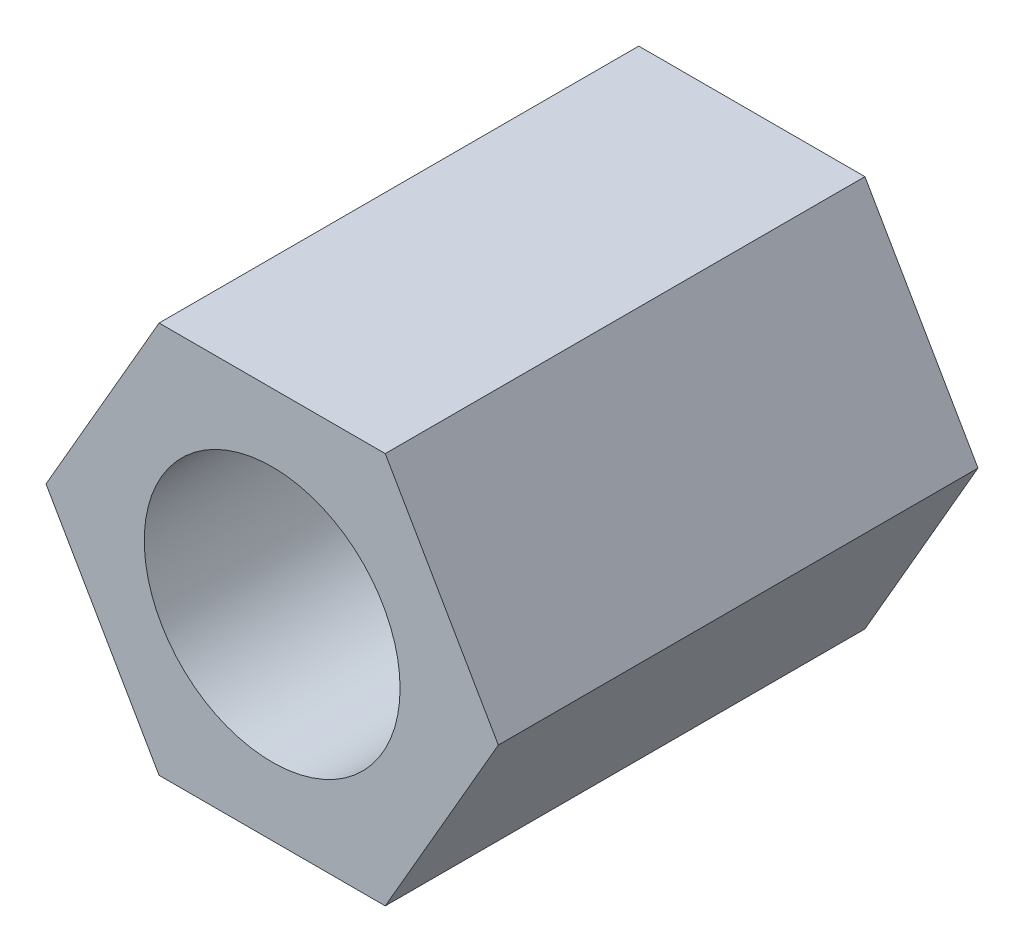
ISO-10303-21;
HEADER;
FILE_DESCRIPTION(('STEP AP214'),'2;1');
FILE_NAME('part.step','',(''),(''),'','','');
FILE_SCHEMA(('AUTOMOTIVE_DESIGN { 1 0 10303 214 1 1 1 1 }'));
ENDSEC;
DATA;
#1=APPLICATION_CONTEXT('core data for automotive mechanical design processes');
#2=APPLICATION_PROTOCOL_DEFINITION('international standard','automotive_design',2000,#1);
#3=PRODUCT_CONTEXT('',#1,'mechanical');
#4=PRODUCT('Part','Part','',(#3));
#5=PRODUCT_RELATED_PRODUCT_CATEGORY('part','',(#4));
#6=PRODUCT_DEFINITION_FORMATION('','',#4);
#7=PRODUCT_DEFINITION_CONTEXT('part definition',#1,'design');
#8=PRODUCT_DEFINITION('design','',#6,#7);
#9=PRODUCT_DEFINITION_SHAPE('','',#8);
#10=(LENGTH_UNIT() NAMED_UNIT(*) SI_UNIT(.MILLI.,.METRE.));
#11=(NAMED_UNIT(*) PLANE_ANGLE_UNIT() SI_UNIT($,.RADIAN.));
#12=(NAMED_UNIT(*) SI_UNIT($,.STERADIAN.) SOLID_ANGLE_UNIT());
#13=UNCERTAINTY_MEASURE_WITH_UNIT(LENGTH_MEASURE(1.E-05),#10,'distance_accuracy_value','');
#14=(GEOMETRIC_REPRESENTATION_CONTEXT(3) GLOBAL_UNCERTAINTY_ASSIGNED_CONTEXT((#13)) GLOBAL_UNIT_ASSIGNED_CONTEXT((#10,
#11,#12)) REPRESENTATION_CONTEXT('',''));
#15=CARTESIAN_POINT('',(0.,0.,0.));
#16=DIRECTION('',(0.,0.,1.));
#17=DIRECTION('',(1.,0.,0.));
#18=AXIS2_PLACEMENT_3D('',#15,#16,#17);
#19=CARTESIAN_POINT('',(0.,0.,6.));
#20=DIRECTION('',(0.,0.,1.));
#21=DIRECTION('',(1.,0.,0.));
#22=AXIS2_PLACEMENT_3D('',#19,#20,#21);
#23=PLANE('',#22);
#24=DIRECTION('',(0.5,0.866025403784439,0.));
#25=VECTOR('',#24,1.);
#26=CARTESIAN_POINT('',(1.41450815951458,-2.45,6.));
#27=LINE('',#26,#25);
#28=CARTESIAN_POINT('',(1.41450815951458,-2.45,6.));
#29=VERTEX_POINT('',#28);
#30=CARTESIAN_POINT('',(2.82901631902917,0.,6.));
#31=VERTEX_POINT('',#30);
#32=EDGE_CURVE('E146',#29,#31,#27,.T.);
#33=ORIENTED_EDGE('',*,*,#32,.T.);
#34=DIRECTION('',(-0.5,0.866025403784439,0.));
#35=VECTOR('',#34,1.);
#36=CARTESIAN_POINT('',(2.82901631902917,0.,6.));
#37=LINE('',#36,#35);
#38=CARTESIAN_POINT('',(1.41450815951458,2.45,6.));
#39=VERTEX_POINT('',#38);
#40=EDGE_CURVE('E94',#31,#39,#37,.T.);
#41=ORIENTED_EDGE('',*,*,#40,.T.);
#42=DIRECTION('',(-1.,0.,0.));
#43=VECTOR('',#42,1.);
#44=CARTESIAN_POINT('',(1.41450815951458,2.45,6.));
#45=LINE('',#44,#43);
#46=CARTESIAN_POINT('',(-1.41450815951458,2.45,6.));
#47=VERTEX_POINT('',#46);
#48=EDGE_CURVE('E107',#39,#47,#45,.T.);
#49=ORIENTED_EDGE('',*,*,#48,.T.);
#50=DIRECTION('',(-0.5,-0.866025403784439,0.));
#51=VECTOR('',#50,1.);
#52=CARTESIAN_POINT('',(-1.41450815951458,2.45,6.));
#53=LINE('',#52,#51);
#54=CARTESIAN_POINT('',(-2.82901631902917,0.,6.));
#55=VERTEX_POINT('',#54);
#56=EDGE_CURVE('E101',#47,#55,#53,.T.);
#57=ORIENTED_EDGE('',*,*,#56,.T.);
#58=DIRECTION('',(0.5,-0.866025403784439,0.));
#59=VECTOR('',#58,1.);
#60=CARTESIAN_POINT('',(-2.82901631902917,0.,6.));
#61=LINE('',#60,#59);
#62=CARTESIAN_POINT('',(-1.41450815951458,-2.45,6.));
#63=VERTEX_POINT('',#62);
#64=EDGE_CURVE('E105',#55,#63,#61,.T.);
#65=ORIENTED_EDGE('',*,*,#64,.T.);
#66=DIRECTION('',(1.,0.,0.));
#67=VECTOR('',#66,1.);
#68=CARTESIAN_POINT('',(-1.41450815951458,-2.45,6.));
#69=LINE('',#68,#67);
#70=EDGE_CURVE('E57',#63,#29,#69,.T.);
#71=ORIENTED_EDGE('',*,*,#70,.T.);
#72=EDGE_LOOP('',(#33,#41,#49,#57,#65,#71));
#73=FACE_BOUND('',#72,.T.);
#74=CARTESIAN_POINT('',(0.,0.,6.));
#75=DIRECTION('',(0.,0.,1.));
#76=DIRECTION('',(1.,0.,0.));
#77=AXIS2_PLACEMENT_3D('',#74,#75,#76);
#78=CIRCLE('',#77,1.6);
#79=CARTESIAN_POINT('',(1.6,0.,6.));
#80=VERTEX_POINT('',#79);
#81=EDGE_CURVE('E134',#80,#80,#78,.T.);
#82=ORIENTED_EDGE('',*,*,#81,.F.);
#83=EDGE_LOOP('',(#82));
#84=FACE_BOUND('',#83,.T.);
#85=ADVANCED_FACE('F39',(#73,#84),#23,.T.);
#86=CARTESIAN_POINT('',(0.,0.,0.));
#87=DIRECTION('',(0.,0.,1.));
#88=DIRECTION('',(1.,0.,0.));
#89=AXIS2_PLACEMENT_3D('',#86,#87,#88);
#90=PLANE('',#89);
#91=DIRECTION('',(0.5,0.866025403784439,0.));
#92=VECTOR('',#91,1.);
#93=CARTESIAN_POINT('',(1.41450815951458,-2.45,0.));
#94=LINE('',#93,#92);
#95=CARTESIAN_POINT('',(1.41450815951458,-2.45,0.));
#96=VERTEX_POINT('',#95);
#97=CARTESIAN_POINT('',(2.82901631902917,0.,0.));
#98=VERTEX_POINT('',#97);
#99=EDGE_CURVE('E129',#96,#98,#94,.T.);
#100=ORIENTED_EDGE('',*,*,#99,.F.);
#101=DIRECTION('',(1.,0.,0.));
#102=VECTOR('',#101,1.);
#103=CARTESIAN_POINT('',(-1.41450815951458,-2.45,0.));
#104=LINE('',#103,#102);
#105=CARTESIAN_POINT('',(-1.41450815951458,-2.45,0.));
#106=VERTEX_POINT('',#105);
#107=EDGE_CURVE('E86',#106,#96,#104,.T.);
#108=ORIENTED_EDGE('',*,*,#107,.F.);
#109=DIRECTION('',(0.5,-0.866025403784439,0.));
#110=VECTOR('',#109,1.);
#111=CARTESIAN_POINT('',(-2.82901631902917,0.,0.));
#112=LINE('',#111,#110);
#113=CARTESIAN_POINT('',(-2.82901631902917,0.,0.));
#114=VERTEX_POINT('',#113);
#115=EDGE_CURVE('E80',#114,#106,#112,.T.);
#116=ORIENTED_EDGE('',*,*,#115,.F.);
#117=DIRECTION('',(-0.5,-0.866025403784439,0.));
#118=VECTOR('',#117,1.);
#119=CARTESIAN_POINT('',(-1.41450815951458,2.45,0.));
#120=LINE('',#119,#118);
#121=CARTESIAN_POINT('',(-1.41450815951458,2.45,0.));
#122=VERTEX_POINT('',#121);
#123=EDGE_CURVE('E116',#122,#114,#120,.T.);
#124=ORIENTED_EDGE('',*,*,#123,.F.);
#125=DIRECTION('',(-1.,0.,0.));
#126=VECTOR('',#125,1.);
#127=CARTESIAN_POINT('',(1.41450815951458,2.45,0.));
#128=LINE('',#127,#126);
#129=CARTESIAN_POINT('',(1.41450815951458,2.45,0.));
#130=VERTEX_POINT('',#129);
#131=EDGE_CURVE('E137',#130,#122,#128,.T.);
#132=ORIENTED_EDGE('',*,*,#131,.F.);
#133=DIRECTION('',(-0.5,0.866025403784439,0.));
#134=VECTOR('',#133,1.);
#135=CARTESIAN_POINT('',(2.82901631902917,0.,0.));
#136=LINE('',#135,#134);
#137=EDGE_CURVE('E133',#98,#130,#136,.T.);
#138=ORIENTED_EDGE('',*,*,#137,.F.);
#139=EDGE_LOOP('',(#100,#108,#116,#124,#132,#138));
#140=FACE_BOUND('',#139,.T.);
#141=CARTESIAN_POINT('',(0.,0.,0.));
#142=DIRECTION('',(0.,0.,1.));
#143=DIRECTION('',(1.,0.,0.));
#144=AXIS2_PLACEMENT_3D('',#141,#142,#143);
#145=CIRCLE('',#144,1.6);
#146=CARTESIAN_POINT('',(1.6,0.,0.));
#147=VERTEX_POINT('',#146);
#148=EDGE_CURVE('E243',#147,#147,#145,.T.);
#149=ORIENTED_EDGE('',*,*,#148,.T.);
#150=EDGE_LOOP('',(#149));
#151=FACE_BOUND('',#150,.T.);
#152=ADVANCED_FACE('F159',(#140,#151),#90,.F.);
#153=CARTESIAN_POINT('',(1.41450815951458,-2.45,6.));
#154=DIRECTION('',(-0.866025403784439,0.5,0.));
#155=DIRECTION('',(-0.5,-0.866025403784439,0.));
#156=AXIS2_PLACEMENT_3D('',#153,#154,#155);
#157=PLANE('',#156);
#158=ORIENTED_EDGE('',*,*,#99,.T.);
#159=DIRECTION('',(0.,0.,-1.));
#160=VECTOR('',#159,1.);
#161=CARTESIAN_POINT('',(2.82901631902917,0.,6.));
#162=LINE('',#161,#160);
#163=EDGE_CURVE('E11',#31,#98,#162,.T.);
#164=ORIENTED_EDGE('',*,*,#163,.F.);
#165=ORIENTED_EDGE('',*,*,#32,.F.);
#166=DIRECTION('',(0.,0.,-1.));
#167=VECTOR('',#166,1.);
#168=CARTESIAN_POINT('',(1.41450815951458,-2.45,6.));
#169=LINE('',#168,#167);
#170=EDGE_CURVE('E125',#29,#96,#169,.T.);
#171=ORIENTED_EDGE('',*,*,#170,.T.);
#172=EDGE_LOOP('',(#158,#164,#165,#171));
#173=FACE_BOUND('',#172,.T.);
#174=ADVANCED_FACE('F41',(#173),#157,.F.);
#175=CARTESIAN_POINT('',(2.82901631902917,0.,6.));
#176=DIRECTION('',(-0.866025403784438,-0.5,0.));
#177=DIRECTION('',(0.5,-0.866025403784439,0.));
#178=AXIS2_PLACEMENT_3D('',#175,#176,#177);
#179=PLANE('',#178);
#180=ORIENTED_EDGE('',*,*,#137,.T.);
#181=DIRECTION('',(0.,0.,-1.));
#182=VECTOR('',#181,1.);
#183=CARTESIAN_POINT('',(1.41450815951458,2.45,6.));
#184=LINE('',#183,#182);
#185=EDGE_CURVE('E49',#39,#130,#184,.T.);
#186=ORIENTED_EDGE('',*,*,#185,.F.);
#187=ORIENTED_EDGE('',*,*,#40,.F.);
#188=ORIENTED_EDGE('',*,*,#163,.T.);
#189=EDGE_LOOP('',(#180,#186,#187,#188));
#190=FACE_BOUND('',#189,.T.);
#191=ADVANCED_FACE('F184',(#190),#179,.F.);
#192=CARTESIAN_POINT('',(1.41450815951458,2.45,6.));
#193=DIRECTION('',(0.,-1.,0.));
#194=DIRECTION('',(0.,0.,-1.));
#195=AXIS2_PLACEMENT_3D('',#192,#193,#194);
#196=PLANE('',#195);
#197=ORIENTED_EDGE('',*,*,#131,.T.);
#198=DIRECTION('',(0.,0.,-1.));
#199=VECTOR('',#198,1.);
#200=CARTESIAN_POINT('',(-1.41450815951458,2.45,6.));
#201=LINE('',#200,#199);
#202=EDGE_CURVE('E118',#47,#122,#201,.T.);
#203=ORIENTED_EDGE('',*,*,#202,.F.);
#204=ORIENTED_EDGE('',*,*,#48,.F.);
#205=ORIENTED_EDGE('',*,*,#185,.T.);
#206=EDGE_LOOP('',(#197,#203,#204,#205));
#207=FACE_BOUND('',#206,.T.);
#208=ADVANCED_FACE('F156',(#207),#196,.F.);
#209=CARTESIAN_POINT('',(-1.41450815951458,2.45,6.));
#210=DIRECTION('',(0.866025403784439,-0.5,0.));
#211=DIRECTION('',(0.5,0.866025403784439,0.));
#212=AXIS2_PLACEMENT_3D('',#209,#210,#211);
#213=PLANE('',#212);
#214=ORIENTED_EDGE('',*,*,#123,.T.);
#215=DIRECTION('',(0.,0.,-1.));
#216=VECTOR('',#215,1.);
#217=CARTESIAN_POINT('',(-2.82901631902917,0.,6.));
#218=LINE('',#217,#216);
#219=EDGE_CURVE('E113',#55,#114,#218,.T.);
#220=ORIENTED_EDGE('',*,*,#219,.F.);
#221=ORIENTED_EDGE('',*,*,#56,.F.);
#222=ORIENTED_EDGE('',*,*,#202,.T.);
#223=EDGE_LOOP('',(#214,#220,#221,#222));
#224=FACE_BOUND('',#223,.T.);
#225=ADVANCED_FACE('F114',(#224),#213,.F.);
#226=CARTESIAN_POINT('',(-2.82901631902917,0.,6.));
#227=DIRECTION('',(0.866025403784438,0.5,0.));
#228=DIRECTION('',(-0.5,0.866025403784439,0.));
#229=AXIS2_PLACEMENT_3D('',#226,#227,#228);
#230=PLANE('',#229);
#231=ORIENTED_EDGE('',*,*,#115,.T.);
#232=DIRECTION('',(0.,0.,-1.));
#233=VECTOR('',#232,1.);
#234=CARTESIAN_POINT('',(-1.41450815951458,-2.45,6.));
#235=LINE('',#234,#233);
#236=EDGE_CURVE('E119',#63,#106,#235,.T.);
#237=ORIENTED_EDGE('',*,*,#236,.F.);
#238=ORIENTED_EDGE('',*,*,#64,.F.);
#239=ORIENTED_EDGE('',*,*,#219,.T.);
#240=EDGE_LOOP('',(#231,#237,#238,#239));
#241=FACE_BOUND('',#240,.T.);
#242=ADVANCED_FACE('F121',(#241),#230,.F.);
#243=CARTESIAN_POINT('',(-1.41450815951458,-2.45,6.));
#244=DIRECTION('',(0.,1.,0.));
#245=DIRECTION('',(0.,0.,1.));
#246=AXIS2_PLACEMENT_3D('',#243,#244,#245);
#247=PLANE('',#246);
#248=ORIENTED_EDGE('',*,*,#107,.T.);
#249=ORIENTED_EDGE('',*,*,#170,.F.);
#250=ORIENTED_EDGE('',*,*,#70,.F.);
#251=ORIENTED_EDGE('',*,*,#236,.T.);
#252=EDGE_LOOP('',(#248,#249,#250,#251));
#253=FACE_BOUND('',#252,.T.);
#254=ADVANCED_FACE('F164',(#253),#247,.F.);
#255=CARTESIAN_POINT('',(0.,0.,6.));
#256=DIRECTION('',(0.,0.,-1.));
#257=DIRECTION('',(-1.,0.,0.));
#258=AXIS2_PLACEMENT_3D('',#255,#256,#257);
#259=CYLINDRICAL_SURFACE('',#258,1.6);
#260=ORIENTED_EDGE('',*,*,#81,.T.);
#261=EDGE_LOOP('',(#260));
#262=FACE_BOUND('',#261,.T.);
#263=ORIENTED_EDGE('',*,*,#148,.F.);
#264=EDGE_LOOP('',(#263));
#265=FACE_BOUND('',#264,.T.);
#266=ADVANCED_FACE('F166',(#262,#265),#259,.F.);
#267=CLOSED_SHELL('',(#85,#152,#174,#191,#208,#225,#242,#254,#266));
#268=MANIFOLD_SOLID_BREP('B2',#267);
#269=ADVANCED_BREP_SHAPE_REPRESENTATION('',(#18,#268),#14);
#270=SHAPE_DEFINITION_REPRESENTATION(#9,#269);
ENDSEC;
END-ISO-10303-21;
